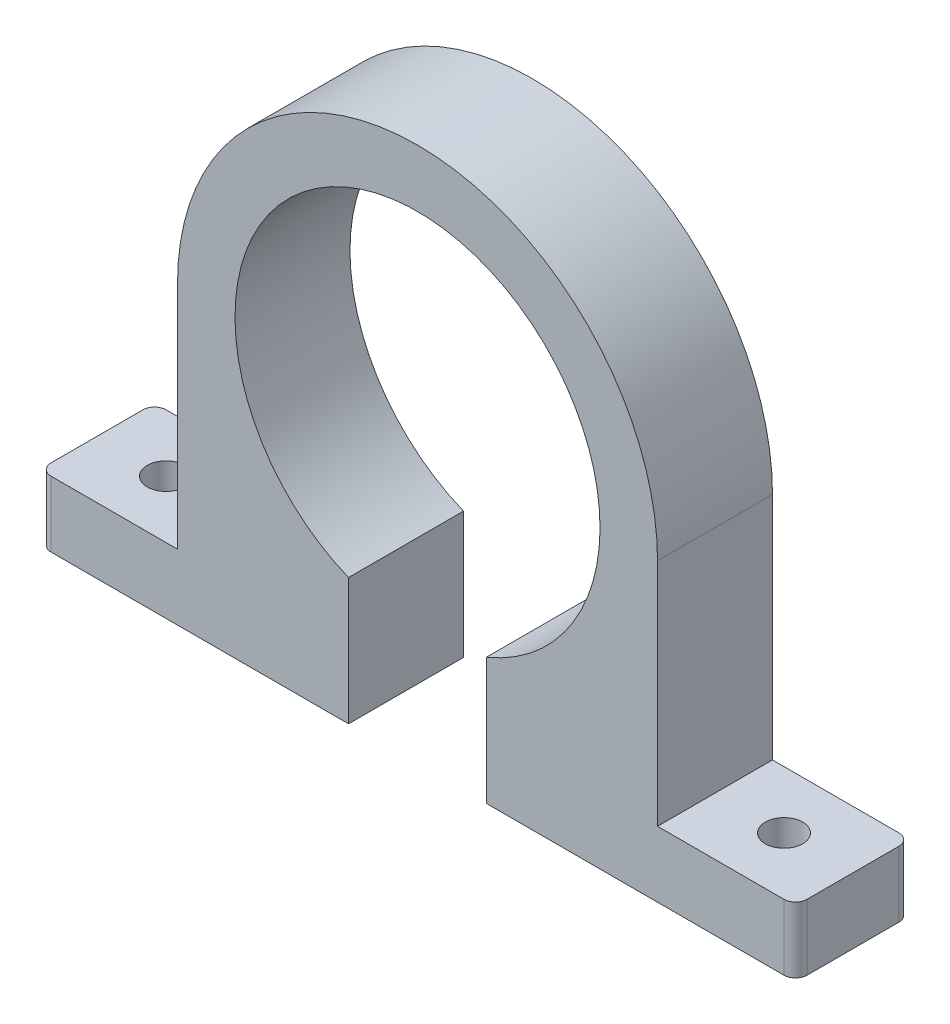
ISO-10303-21;
HEADER;
FILE_DESCRIPTION(('STEP AP214'),'2;1');
FILE_NAME('part.step','',(''),(''),'','','');
FILE_SCHEMA(('AUTOMOTIVE_DESIGN { 1 0 10303 214 1 1 1 1 }'));
ENDSEC;
DATA;
#1=APPLICATION_CONTEXT('core data for automotive mechanical design processes');
#2=APPLICATION_PROTOCOL_DEFINITION('international standard','automotive_design',2000,#1);
#3=PRODUCT_CONTEXT('',#1,'mechanical');
#4=PRODUCT('Part','Part','',(#3));
#5=PRODUCT_RELATED_PRODUCT_CATEGORY('part','',(#4));
#6=PRODUCT_DEFINITION_FORMATION('','',#4);
#7=PRODUCT_DEFINITION_CONTEXT('part definition',#1,'design');
#8=PRODUCT_DEFINITION('design','',#6,#7);
#9=PRODUCT_DEFINITION_SHAPE('','',#8);
#10=(LENGTH_UNIT() NAMED_UNIT(*) SI_UNIT(.MILLI.,.METRE.));
#11=(NAMED_UNIT(*) PLANE_ANGLE_UNIT() SI_UNIT($,.RADIAN.));
#12=(NAMED_UNIT(*) SI_UNIT($,.STERADIAN.) SOLID_ANGLE_UNIT());
#13=UNCERTAINTY_MEASURE_WITH_UNIT(LENGTH_MEASURE(1.E-05),#10,'distance_accuracy_value','');
#14=(GEOMETRIC_REPRESENTATION_CONTEXT(3) GLOBAL_UNCERTAINTY_ASSIGNED_CONTEXT((#13)) GLOBAL_UNIT_ASSIGNED_CONTEXT((#10,
#11,#12)) REPRESENTATION_CONTEXT('',''));
#15=CARTESIAN_POINT('',(0.,0.,0.));
#16=DIRECTION('',(0.,0.,1.));
#17=DIRECTION('',(1.,0.,0.));
#18=AXIS2_PLACEMENT_3D('',#15,#16,#17);
#19=CARTESIAN_POINT('',(32.875,-20.,10.));
#20=DIRECTION('',(0.,-1.,0.));
#21=DIRECTION('',(1.,0.,0.));
#22=AXIS2_PLACEMENT_3D('',#19,#20,#21);
#23=PLANE('',#22);
#24=DIRECTION('',(0.,0.,-1.));
#25=VECTOR('',#24,1.);
#26=CARTESIAN_POINT('',(32.875,-20.,10.));
#27=LINE('',#26,#25);
#28=CARTESIAN_POINT('',(32.875,-20.,9.));
#29=VERTEX_POINT('',#28);
#30=CARTESIAN_POINT('',(32.875,-20.,0.999999999999999));
#31=VERTEX_POINT('',#30);
#32=EDGE_CURVE('E243',#29,#31,#27,.T.);
#33=ORIENTED_EDGE('',*,*,#32,.T.);
#34=CARTESIAN_POINT('',(31.875,-20.,0.999999999999999));
#35=DIRECTION('',(0.,-1.,0.));
#36=DIRECTION('',(1.,0.,0.));
#37=AXIS2_PLACEMENT_3D('',#34,#35,#36);
#38=CIRCLE('',#37,1.);
#39=CARTESIAN_POINT('',(31.875,-20.,0.));
#40=VERTEX_POINT('',#39);
#41=EDGE_CURVE('E185',#31,#40,#38,.F.);
#42=ORIENTED_EDGE('',*,*,#41,.T.);
#43=DIRECTION('',(-1.,0.,0.));
#44=VECTOR('',#43,1.);
#45=CARTESIAN_POINT('',(32.875,-20.,0.));
#46=LINE('',#45,#44);
#47=CARTESIAN_POINT('',(20.875,-20.,0.));
#48=VERTEX_POINT('',#47);
#49=EDGE_CURVE('E265',#40,#48,#46,.T.);
#50=ORIENTED_EDGE('',*,*,#49,.T.);
#51=DIRECTION('',(0.,0.,-1.));
#52=VECTOR('',#51,1.);
#53=CARTESIAN_POINT('',(20.875,-20.,10.));
#54=LINE('',#53,#52);
#55=CARTESIAN_POINT('',(20.875,-20.,10.));
#56=VERTEX_POINT('',#55);
#57=EDGE_CURVE('E240',#56,#48,#54,.T.);
#58=ORIENTED_EDGE('',*,*,#57,.F.);
#59=DIRECTION('',(-1.,0.,0.));
#60=VECTOR('',#59,1.);
#61=CARTESIAN_POINT('',(32.875,-20.,10.));
#62=LINE('',#61,#60);
#63=CARTESIAN_POINT('',(31.875,-20.,10.));
#64=VERTEX_POINT('',#63);
#65=EDGE_CURVE('E293',#64,#56,#62,.T.);
#66=ORIENTED_EDGE('',*,*,#65,.F.);
#67=CARTESIAN_POINT('',(31.875,-20.,9.));
#68=DIRECTION('',(0.,-1.,0.));
#69=DIRECTION('',(1.,0.,0.));
#70=AXIS2_PLACEMENT_3D('',#67,#68,#69);
#71=CIRCLE('',#70,1.);
#72=EDGE_CURVE('E183',#64,#29,#71,.F.);
#73=ORIENTED_EDGE('',*,*,#72,.T.);
#74=EDGE_LOOP('',(#33,#42,#50,#58,#66,#73));
#75=FACE_BOUND('',#74,.T.);
#76=CARTESIAN_POINT('',(26.875,-20.,5.));
#77=DIRECTION('',(0.,1.,0.));
#78=DIRECTION('',(0.,0.,1.));
#79=AXIS2_PLACEMENT_3D('',#76,#77,#78);
#80=CIRCLE('',#79,1.63195);
#81=CARTESIAN_POINT('',(26.875,-20.,6.63195));
#82=VERTEX_POINT('',#81);
#83=EDGE_CURVE('E284',#82,#82,#80,.T.);
#84=ORIENTED_EDGE('',*,*,#83,.F.);
#85=EDGE_LOOP('',(#84));
#86=FACE_BOUND('',#85,.T.);
#87=ADVANCED_FACE('F33',(#75,#86),#23,.F.);
#88=CARTESIAN_POINT('',(-6.,-25.72,10.));
#89=DIRECTION('',(-1.,0.,0.));
#90=DIRECTION('',(0.,0.,1.));
#91=AXIS2_PLACEMENT_3D('',#88,#89,#90);
#92=PLANE('',#91);
#93=DIRECTION('',(0.,1.,0.));
#94=VECTOR('',#93,1.);
#95=CARTESIAN_POINT('',(-6.,-25.72,0.));
#96=LINE('',#95,#94);
#97=CARTESIAN_POINT('',(-6.,-25.72,0.));
#98=VERTEX_POINT('',#97);
#99=CARTESIAN_POINT('',(-6.,-14.6974700203811,0.));
#100=VERTEX_POINT('',#99);
#101=EDGE_CURVE('E172',#98,#100,#96,.T.);
#102=ORIENTED_EDGE('',*,*,#101,.T.);
#103=DIRECTION('',(0.,0.,-1.));
#104=VECTOR('',#103,1.);
#105=CARTESIAN_POINT('',(-6.,-14.6974700203811,10.));
#106=LINE('',#105,#104);
#107=CARTESIAN_POINT('',(-6.,-14.6974700203811,10.));
#108=VERTEX_POINT('',#107);
#109=EDGE_CURVE('E150',#108,#100,#106,.T.);
#110=ORIENTED_EDGE('',*,*,#109,.F.);
#111=DIRECTION('',(0.,1.,0.));
#112=VECTOR('',#111,1.);
#113=CARTESIAN_POINT('',(-6.,-25.72,10.));
#114=LINE('',#113,#112);
#115=CARTESIAN_POINT('',(-6.,-25.72,10.));
#116=VERTEX_POINT('',#115);
#117=EDGE_CURVE('E157',#116,#108,#114,.T.);
#118=ORIENTED_EDGE('',*,*,#117,.F.);
#119=DIRECTION('',(0.,0.,-1.));
#120=VECTOR('',#119,1.);
#121=CARTESIAN_POINT('',(-6.,-25.72,10.));
#122=LINE('',#121,#120);
#123=EDGE_CURVE('E226',#116,#98,#122,.T.);
#124=ORIENTED_EDGE('',*,*,#123,.T.);
#125=EDGE_LOOP('',(#102,#110,#118,#124));
#126=FACE_BOUND('',#125,.T.);
#127=ADVANCED_FACE('F170',(#126),#92,.F.);
#128=CARTESIAN_POINT('',(0.,0.,10.));
#129=DIRECTION('',(0.,0.,-1.));
#130=DIRECTION('',(-1.,0.,0.));
#131=AXIS2_PLACEMENT_3D('',#128,#129,#130);
#132=CYLINDRICAL_SURFACE('',#131,15.875);
#133=CARTESIAN_POINT('',(0.,0.,0.));
#134=DIRECTION('',(0.,0.,-1.));
#135=DIRECTION('',(1.,0.,0.));
#136=AXIS2_PLACEMENT_3D('',#133,#134,#135);
#137=CIRCLE('',#136,15.875);
#138=CARTESIAN_POINT('',(6.,-14.6974700203811,0.));
#139=VERTEX_POINT('',#138);
#140=EDGE_CURVE('E269',#100,#139,#137,.T.);
#141=ORIENTED_EDGE('',*,*,#140,.T.);
#142=DIRECTION('',(0.,0.,-1.));
#143=VECTOR('',#142,1.);
#144=CARTESIAN_POINT('',(6.,-14.6974700203811,10.));
#145=LINE('',#144,#143);
#146=CARTESIAN_POINT('',(6.,-14.6974700203811,10.));
#147=VERTEX_POINT('',#146);
#148=EDGE_CURVE('E153',#147,#139,#145,.T.);
#149=ORIENTED_EDGE('',*,*,#148,.F.);
#150=CARTESIAN_POINT('',(0.,0.,10.));
#151=DIRECTION('',(0.,0.,-1.));
#152=DIRECTION('',(1.,0.,0.));
#153=AXIS2_PLACEMENT_3D('',#150,#151,#152);
#154=CIRCLE('',#153,15.875);
#155=EDGE_CURVE('E146',#108,#147,#154,.T.);
#156=ORIENTED_EDGE('',*,*,#155,.F.);
#157=ORIENTED_EDGE('',*,*,#109,.T.);
#158=EDGE_LOOP('',(#141,#149,#156,#157));
#159=FACE_BOUND('',#158,.T.);
#160=ADVANCED_FACE('F148',(#159),#132,.F.);
#161=CARTESIAN_POINT('',(6.,-25.72,10.));
#162=DIRECTION('',(1.,0.,0.));
#163=DIRECTION('',(0.,0.,-1.));
#164=AXIS2_PLACEMENT_3D('',#161,#162,#163);
#165=PLANE('',#164);
#166=DIRECTION('',(0.,-1.,0.));
#167=VECTOR('',#166,1.);
#168=CARTESIAN_POINT('',(6.,-25.72,0.));
#169=LINE('',#168,#167);
#170=CARTESIAN_POINT('',(6.,-25.72,0.));
#171=VERTEX_POINT('',#170);
#172=EDGE_CURVE('E263',#139,#171,#169,.T.);
#173=ORIENTED_EDGE('',*,*,#172,.T.);
#174=DIRECTION('',(0.,0.,-1.));
#175=VECTOR('',#174,1.);
#176=CARTESIAN_POINT('',(6.,-25.72,10.));
#177=LINE('',#176,#175);
#178=CARTESIAN_POINT('',(6.,-25.72,10.));
#179=VERTEX_POINT('',#178);
#180=EDGE_CURVE('E177',#179,#171,#177,.T.);
#181=ORIENTED_EDGE('',*,*,#180,.F.);
#182=DIRECTION('',(0.,-1.,0.));
#183=VECTOR('',#182,1.);
#184=CARTESIAN_POINT('',(6.,-25.72,10.));
#185=LINE('',#184,#183);
#186=EDGE_CURVE('E156',#147,#179,#185,.T.);
#187=ORIENTED_EDGE('',*,*,#186,.F.);
#188=ORIENTED_EDGE('',*,*,#148,.T.);
#189=EDGE_LOOP('',(#173,#181,#187,#188));
#190=FACE_BOUND('',#189,.T.);
#191=ADVANCED_FACE('F337',(#190),#165,.F.);
#192=CARTESIAN_POINT('',(6.,-25.72,10.));
#193=DIRECTION('',(0.,1.,0.));
#194=DIRECTION('',(0.,0.,1.));
#195=AXIS2_PLACEMENT_3D('',#192,#193,#194);
#196=PLANE('',#195);
#197=CARTESIAN_POINT('',(26.875,-25.72,5.));
#198=DIRECTION('',(0.,1.,0.));
#199=DIRECTION('',(0.,0.,1.));
#200=AXIS2_PLACEMENT_3D('',#197,#198,#199);
#201=CIRCLE('',#200,1.63195);
#202=CARTESIAN_POINT('',(26.875,-25.72,6.63195));
#203=VERTEX_POINT('',#202);
#204=EDGE_CURVE('E281',#203,#203,#201,.T.);
#205=ORIENTED_EDGE('',*,*,#204,.T.);
#206=EDGE_LOOP('',(#205));
#207=FACE_BOUND('',#206,.T.);
#208=DIRECTION('',(1.,0.,0.));
#209=VECTOR('',#208,1.);
#210=CARTESIAN_POINT('',(6.,-25.72,0.));
#211=LINE('',#210,#209);
#212=CARTESIAN_POINT('',(31.875,-25.72,0.));
#213=VERTEX_POINT('',#212);
#214=EDGE_CURVE('E255',#171,#213,#211,.T.);
#215=ORIENTED_EDGE('',*,*,#214,.T.);
#216=CARTESIAN_POINT('',(31.875,-25.72,0.999999999999999));
#217=DIRECTION('',(0.,1.,0.));
#218=DIRECTION('',(0.,0.,1.));
#219=AXIS2_PLACEMENT_3D('',#216,#217,#218);
#220=CIRCLE('',#219,1.);
#221=CARTESIAN_POINT('',(32.875,-25.72,0.999999999999999));
#222=VERTEX_POINT('',#221);
#223=EDGE_CURVE('E193',#213,#222,#220,.F.);
#224=ORIENTED_EDGE('',*,*,#223,.T.);
#225=DIRECTION('',(0.,0.,-1.));
#226=VECTOR('',#225,1.);
#227=CARTESIAN_POINT('',(32.875,-25.72,10.));
#228=LINE('',#227,#226);
#229=CARTESIAN_POINT('',(32.875,-25.72,9.));
#230=VERTEX_POINT('',#229);
#231=EDGE_CURVE('E246',#230,#222,#228,.T.);
#232=ORIENTED_EDGE('',*,*,#231,.F.);
#233=CARTESIAN_POINT('',(31.875,-25.72,9.));
#234=DIRECTION('',(0.,1.,0.));
#235=DIRECTION('',(0.,0.,1.));
#236=AXIS2_PLACEMENT_3D('',#233,#234,#235);
#237=CIRCLE('',#236,1.);
#238=CARTESIAN_POINT('',(31.875,-25.72,10.));
#239=VERTEX_POINT('',#238);
#240=EDGE_CURVE('E191',#230,#239,#237,.F.);
#241=ORIENTED_EDGE('',*,*,#240,.T.);
#242=DIRECTION('',(1.,0.,0.));
#243=VECTOR('',#242,1.);
#244=CARTESIAN_POINT('',(6.,-25.72,10.));
#245=LINE('',#244,#243);
#246=EDGE_CURVE('E257',#179,#239,#245,.T.);
#247=ORIENTED_EDGE('',*,*,#246,.F.);
#248=ORIENTED_EDGE('',*,*,#180,.T.);
#249=EDGE_LOOP('',(#215,#224,#232,#241,#247,#248));
#250=FACE_BOUND('',#249,.T.);
#251=ADVANCED_FACE('F254',(#207,#250),#196,.F.);
#252=CARTESIAN_POINT('',(32.875,-25.72,10.));
#253=DIRECTION('',(-1.,0.,0.));
#254=DIRECTION('',(0.,0.,1.));
#255=AXIS2_PLACEMENT_3D('',#252,#253,#254);
#256=PLANE('',#255);
#257=ORIENTED_EDGE('',*,*,#231,.T.);
#258=DIRECTION('',(0.,1.,0.));
#259=VECTOR('',#258,1.);
#260=CARTESIAN_POINT('',(32.875,-25.72,0.999999999999999));
#261=LINE('',#260,#259);
#262=EDGE_CURVE('E175',#222,#31,#261,.T.);
#263=ORIENTED_EDGE('',*,*,#262,.T.);
#264=ORIENTED_EDGE('',*,*,#32,.F.);
#265=DIRECTION('',(0.,1.,0.));
#266=VECTOR('',#265,1.);
#267=CARTESIAN_POINT('',(32.875,-25.72,9.));
#268=LINE('',#267,#266);
#269=EDGE_CURVE('E173',#29,#230,#268,.F.);
#270=ORIENTED_EDGE('',*,*,#269,.T.);
#271=EDGE_LOOP('',(#257,#263,#264,#270));
#272=FACE_BOUND('',#271,.T.);
#273=ADVANCED_FACE('F331',(#272),#256,.F.);
#274=CARTESIAN_POINT('',(20.875,-20.,10.));
#275=DIRECTION('',(-1.,0.,0.));
#276=DIRECTION('',(0.,-1.,0.));
#277=AXIS2_PLACEMENT_3D('',#274,#275,#276);
#278=PLANE('',#277);
#279=DIRECTION('',(0.,1.,0.));
#280=VECTOR('',#279,1.);
#281=CARTESIAN_POINT('',(20.875,-20.,0.));
#282=LINE('',#281,#280);
#283=CARTESIAN_POINT('',(20.875,0.,0.));
#284=VERTEX_POINT('',#283);
#285=EDGE_CURVE('E267',#48,#284,#282,.T.);
#286=ORIENTED_EDGE('',*,*,#285,.T.);
#287=DIRECTION('',(0.,0.,-1.));
#288=VECTOR('',#287,1.);
#289=CARTESIAN_POINT('',(20.875,0.,10.));
#290=LINE('',#289,#288);
#291=CARTESIAN_POINT('',(20.875,0.,10.));
#292=VERTEX_POINT('',#291);
#293=EDGE_CURVE('E237',#292,#284,#290,.T.);
#294=ORIENTED_EDGE('',*,*,#293,.F.);
#295=DIRECTION('',(0.,1.,0.));
#296=VECTOR('',#295,1.);
#297=CARTESIAN_POINT('',(20.875,-20.,10.));
#298=LINE('',#297,#296);
#299=EDGE_CURVE('E291',#56,#292,#298,.T.);
#300=ORIENTED_EDGE('',*,*,#299,.F.);
#301=ORIENTED_EDGE('',*,*,#57,.T.);
#302=EDGE_LOOP('',(#286,#294,#300,#301));
#303=FACE_BOUND('',#302,.T.);
#304=ADVANCED_FACE('F329',(#303),#278,.F.);
#305=CARTESIAN_POINT('',(0.,0.,10.));
#306=DIRECTION('',(0.,0.,-1.));
#307=DIRECTION('',(-1.,0.,0.));
#308=AXIS2_PLACEMENT_3D('',#305,#306,#307);
#309=CYLINDRICAL_SURFACE('',#308,20.875);
#310=CARTESIAN_POINT('',(0.,0.,0.));
#311=DIRECTION('',(0.,0.,1.));
#312=DIRECTION('',(1.,0.,0.));
#313=AXIS2_PLACEMENT_3D('',#310,#311,#312);
#314=CIRCLE('',#313,20.875);
#315=CARTESIAN_POINT('',(-20.875,0.,0.));
#316=VERTEX_POINT('',#315);
#317=EDGE_CURVE('E274',#284,#316,#314,.T.);
#318=ORIENTED_EDGE('',*,*,#317,.T.);
#319=DIRECTION('',(0.,0.,-1.));
#320=VECTOR('',#319,1.);
#321=CARTESIAN_POINT('',(-20.875,0.,10.));
#322=LINE('',#321,#320);
#323=CARTESIAN_POINT('',(-20.875,0.,10.));
#324=VERTEX_POINT('',#323);
#325=EDGE_CURVE('E234',#324,#316,#322,.T.);
#326=ORIENTED_EDGE('',*,*,#325,.F.);
#327=CARTESIAN_POINT('',(0.,0.,10.));
#328=DIRECTION('',(0.,0.,1.));
#329=DIRECTION('',(1.,0.,0.));
#330=AXIS2_PLACEMENT_3D('',#327,#328,#329);
#331=CIRCLE('',#330,20.875);
#332=EDGE_CURVE('E289',#292,#324,#331,.T.);
#333=ORIENTED_EDGE('',*,*,#332,.F.);
#334=ORIENTED_EDGE('',*,*,#293,.T.);
#335=EDGE_LOOP('',(#318,#326,#333,#334));
#336=FACE_BOUND('',#335,.T.);
#337=ADVANCED_FACE('F316',(#336),#309,.T.);
#338=CARTESIAN_POINT('',(-20.875,0.,10.));
#339=DIRECTION('',(1.,0.,0.));
#340=DIRECTION('',(0.,1.,0.));
#341=AXIS2_PLACEMENT_3D('',#338,#339,#340);
#342=PLANE('',#341);
#343=DIRECTION('',(0.,-1.,0.));
#344=VECTOR('',#343,1.);
#345=CARTESIAN_POINT('',(-20.875,0.,0.));
#346=LINE('',#345,#344);
#347=CARTESIAN_POINT('',(-20.875,-20.,0.));
#348=VERTEX_POINT('',#347);
#349=EDGE_CURVE('E276',#316,#348,#346,.T.);
#350=ORIENTED_EDGE('',*,*,#349,.T.);
#351=DIRECTION('',(0.,0.,-1.));
#352=VECTOR('',#351,1.);
#353=CARTESIAN_POINT('',(-20.875,-20.,10.));
#354=LINE('',#353,#352);
#355=CARTESIAN_POINT('',(-20.875,-20.,10.));
#356=VERTEX_POINT('',#355);
#357=EDGE_CURVE('E228',#356,#348,#354,.T.);
#358=ORIENTED_EDGE('',*,*,#357,.F.);
#359=DIRECTION('',(0.,-1.,0.));
#360=VECTOR('',#359,1.);
#361=CARTESIAN_POINT('',(-20.875,0.,10.));
#362=LINE('',#361,#360);
#363=EDGE_CURVE('E217',#324,#356,#362,.T.);
#364=ORIENTED_EDGE('',*,*,#363,.F.);
#365=ORIENTED_EDGE('',*,*,#325,.T.);
#366=EDGE_LOOP('',(#350,#358,#364,#365));
#367=FACE_BOUND('',#366,.T.);
#368=ADVANCED_FACE('F309',(#367),#342,.F.);
#369=CARTESIAN_POINT('',(-20.875,-20.,10.));
#370=DIRECTION('',(0.,-1.,0.));
#371=DIRECTION('',(1.,0.,0.));
#372=AXIS2_PLACEMENT_3D('',#369,#370,#371);
#373=PLANE('',#372);
#374=CARTESIAN_POINT('',(-26.875,-20.,5.));
#375=DIRECTION('',(0.,1.,0.));
#376=DIRECTION('',(0.,0.,1.));
#377=AXIS2_PLACEMENT_3D('',#374,#375,#376);
#378=CIRCLE('',#377,1.63195);
#379=CARTESIAN_POINT('',(-26.875,-20.,6.63195));
#380=VERTEX_POINT('',#379);
#381=EDGE_CURVE('E302',#380,#380,#378,.T.);
#382=ORIENTED_EDGE('',*,*,#381,.F.);
#383=EDGE_LOOP('',(#382));
#384=FACE_BOUND('',#383,.T.);
#385=DIRECTION('',(-1.,0.,0.));
#386=VECTOR('',#385,1.);
#387=CARTESIAN_POINT('',(-20.875,-20.,0.));
#388=LINE('',#387,#386);
#389=CARTESIAN_POINT('',(-31.875,-20.,0.));
#390=VERTEX_POINT('',#389);
#391=EDGE_CURVE('E278',#348,#390,#388,.T.);
#392=ORIENTED_EDGE('',*,*,#391,.T.);
#393=CARTESIAN_POINT('',(-31.875,-20.,0.999999999999999));
#394=DIRECTION('',(0.,-1.,0.));
#395=DIRECTION('',(1.,0.,0.));
#396=AXIS2_PLACEMENT_3D('',#393,#394,#395);
#397=CIRCLE('',#396,1.);
#398=CARTESIAN_POINT('',(-32.875,-20.,0.999999999999999));
#399=VERTEX_POINT('',#398);
#400=EDGE_CURVE('E11',#390,#399,#397,.F.);
#401=ORIENTED_EDGE('',*,*,#400,.T.);
#402=DIRECTION('',(0.,0.,-1.));
#403=VECTOR('',#402,1.);
#404=CARTESIAN_POINT('',(-32.875,-20.,10.));
#405=LINE('',#404,#403);
#406=CARTESIAN_POINT('',(-32.875,-20.,9.));
#407=VERTEX_POINT('',#406);
#408=EDGE_CURVE('E213',#407,#399,#405,.T.);
#409=ORIENTED_EDGE('',*,*,#408,.F.);
#410=CARTESIAN_POINT('',(-31.875,-20.,9.));
#411=DIRECTION('',(0.,-1.,0.));
#412=DIRECTION('',(1.,0.,0.));
#413=AXIS2_PLACEMENT_3D('',#410,#411,#412);
#414=CIRCLE('',#413,1.);
#415=CARTESIAN_POINT('',(-31.875,-20.,10.));
#416=VERTEX_POINT('',#415);
#417=EDGE_CURVE('E41',#407,#416,#414,.F.);
#418=ORIENTED_EDGE('',*,*,#417,.T.);
#419=DIRECTION('',(-1.,0.,0.));
#420=VECTOR('',#419,1.);
#421=CARTESIAN_POINT('',(-20.875,-20.,10.));
#422=LINE('',#421,#420);
#423=EDGE_CURVE('E212',#356,#416,#422,.T.);
#424=ORIENTED_EDGE('',*,*,#423,.F.);
#425=ORIENTED_EDGE('',*,*,#357,.T.);
#426=EDGE_LOOP('',(#392,#401,#409,#418,#424,#425));
#427=FACE_BOUND('',#426,.T.);
#428=ADVANCED_FACE('F210',(#384,#427),#373,.F.);
#429=CARTESIAN_POINT('',(-32.875,-20.,10.));
#430=DIRECTION('',(1.,0.,0.));
#431=DIRECTION('',(0.,0.,-1.));
#432=AXIS2_PLACEMENT_3D('',#429,#430,#431);
#433=PLANE('',#432);
#434=ORIENTED_EDGE('',*,*,#408,.T.);
#435=DIRECTION('',(0.,-1.,0.));
#436=VECTOR('',#435,1.);
#437=CARTESIAN_POINT('',(-32.875,-20.,0.999999999999999));
#438=LINE('',#437,#436);
#439=CARTESIAN_POINT('',(-32.875,-25.72,0.999999999999999));
#440=VERTEX_POINT('',#439);
#441=EDGE_CURVE('E201',#399,#440,#438,.T.);
#442=ORIENTED_EDGE('',*,*,#441,.T.);
#443=DIRECTION('',(0.,0.,-1.));
#444=VECTOR('',#443,1.);
#445=CARTESIAN_POINT('',(-32.875,-25.72,10.));
#446=LINE('',#445,#444);
#447=CARTESIAN_POINT('',(-32.875,-25.72,9.));
#448=VERTEX_POINT('',#447);
#449=EDGE_CURVE('E223',#448,#440,#446,.T.);
#450=ORIENTED_EDGE('',*,*,#449,.F.);
#451=DIRECTION('',(0.,-1.,0.));
#452=VECTOR('',#451,1.);
#453=CARTESIAN_POINT('',(-32.875,-20.,9.));
#454=LINE('',#453,#452);
#455=EDGE_CURVE('E53',#448,#407,#454,.F.);
#456=ORIENTED_EDGE('',*,*,#455,.T.);
#457=EDGE_LOOP('',(#434,#442,#450,#456));
#458=FACE_BOUND('',#457,.T.);
#459=ADVANCED_FACE('F224',(#458),#433,.F.);
#460=CARTESIAN_POINT('',(-32.875,-25.72,10.));
#461=DIRECTION('',(0.,1.,0.));
#462=DIRECTION('',(0.,0.,1.));
#463=AXIS2_PLACEMENT_3D('',#460,#461,#462);
#464=PLANE('',#463);
#465=CARTESIAN_POINT('',(-26.875,-25.72,5.));
#466=DIRECTION('',(0.,1.,0.));
#467=DIRECTION('',(0.,0.,1.));
#468=AXIS2_PLACEMENT_3D('',#465,#466,#467);
#469=CIRCLE('',#468,1.63195);
#470=CARTESIAN_POINT('',(-26.875,-25.72,6.63195));
#471=VERTEX_POINT('',#470);
#472=EDGE_CURVE('E299',#471,#471,#469,.T.);
#473=ORIENTED_EDGE('',*,*,#472,.T.);
#474=EDGE_LOOP('',(#473));
#475=FACE_BOUND('',#474,.T.);
#476=ORIENTED_EDGE('',*,*,#449,.T.);
#477=CARTESIAN_POINT('',(-31.875,-25.72,0.999999999999999));
#478=DIRECTION('',(0.,1.,0.));
#479=DIRECTION('',(0.,0.,1.));
#480=AXIS2_PLACEMENT_3D('',#477,#478,#479);
#481=CIRCLE('',#480,1.);
#482=CARTESIAN_POINT('',(-31.875,-25.72,0.));
#483=VERTEX_POINT('',#482);
#484=EDGE_CURVE('E206',#440,#483,#481,.F.);
#485=ORIENTED_EDGE('',*,*,#484,.T.);
#486=DIRECTION('',(1.,0.,0.));
#487=VECTOR('',#486,1.);
#488=CARTESIAN_POINT('',(-32.875,-25.72,0.));
#489=LINE('',#488,#487);
#490=EDGE_CURVE('E168',#483,#98,#489,.T.);
#491=ORIENTED_EDGE('',*,*,#490,.T.);
#492=ORIENTED_EDGE('',*,*,#123,.F.);
#493=DIRECTION('',(1.,0.,0.));
#494=VECTOR('',#493,1.);
#495=CARTESIAN_POINT('',(-32.875,-25.72,10.));
#496=LINE('',#495,#494);
#497=CARTESIAN_POINT('',(-31.875,-25.72,10.));
#498=VERTEX_POINT('',#497);
#499=EDGE_CURVE('E164',#498,#116,#496,.T.);
#500=ORIENTED_EDGE('',*,*,#499,.F.);
#501=CARTESIAN_POINT('',(-31.875,-25.72,9.));
#502=DIRECTION('',(0.,1.,0.));
#503=DIRECTION('',(0.,0.,1.));
#504=AXIS2_PLACEMENT_3D('',#501,#502,#503);
#505=CIRCLE('',#504,1.);
#506=EDGE_CURVE('E204',#498,#448,#505,.F.);
#507=ORIENTED_EDGE('',*,*,#506,.T.);
#508=EDGE_LOOP('',(#476,#485,#491,#492,#500,#507));
#509=FACE_BOUND('',#508,.T.);
#510=ADVANCED_FACE('F222',(#475,#509),#464,.F.);
#511=CARTESIAN_POINT('',(0.,0.,10.));
#512=DIRECTION('',(0.,0.,1.));
#513=DIRECTION('',(1.,0.,0.));
#514=AXIS2_PLACEMENT_3D('',#511,#512,#513);
#515=PLANE('',#514);
#516=ORIENTED_EDGE('',*,*,#246,.T.);
#517=DIRECTION('',(0.,1.,0.));
#518=VECTOR('',#517,1.);
#519=CARTESIAN_POINT('',(31.875,-20.,10.));
#520=LINE('',#519,#518);
#521=EDGE_CURVE('E197',#239,#64,#520,.T.);
#522=ORIENTED_EDGE('',*,*,#521,.T.);
#523=ORIENTED_EDGE('',*,*,#65,.T.);
#524=ORIENTED_EDGE('',*,*,#299,.T.);
#525=ORIENTED_EDGE('',*,*,#332,.T.);
#526=ORIENTED_EDGE('',*,*,#363,.T.);
#527=ORIENTED_EDGE('',*,*,#423,.T.);
#528=DIRECTION('',(0.,-1.,0.));
#529=VECTOR('',#528,1.);
#530=CARTESIAN_POINT('',(-31.875,-25.72,10.));
#531=LINE('',#530,#529);
#532=EDGE_CURVE('E195',#416,#498,#531,.T.);
#533=ORIENTED_EDGE('',*,*,#532,.T.);
#534=ORIENTED_EDGE('',*,*,#499,.T.);
#535=ORIENTED_EDGE('',*,*,#117,.T.);
#536=ORIENTED_EDGE('',*,*,#155,.T.);
#537=ORIENTED_EDGE('',*,*,#186,.T.);
#538=EDGE_LOOP('',(#516,#522,#523,#524,#525,#526,#527,#533,#534,#535,#536,#537));
#539=FACE_BOUND('',#538,.T.);
#540=ADVANCED_FACE('F161',(#539),#515,.T.);
#541=CARTESIAN_POINT('',(0.,0.,0.));
#542=DIRECTION('',(0.,0.,1.));
#543=DIRECTION('',(1.,0.,0.));
#544=AXIS2_PLACEMENT_3D('',#541,#542,#543);
#545=PLANE('',#544);
#546=ORIENTED_EDGE('',*,*,#49,.F.);
#547=DIRECTION('',(0.,1.,0.));
#548=VECTOR('',#547,1.);
#549=CARTESIAN_POINT('',(31.875,0.,0.));
#550=LINE('',#549,#548);
#551=EDGE_CURVE('E189',#40,#213,#550,.F.);
#552=ORIENTED_EDGE('',*,*,#551,.T.);
#553=ORIENTED_EDGE('',*,*,#214,.F.);
#554=ORIENTED_EDGE('',*,*,#172,.F.);
#555=ORIENTED_EDGE('',*,*,#140,.F.);
#556=ORIENTED_EDGE('',*,*,#101,.F.);
#557=ORIENTED_EDGE('',*,*,#490,.F.);
#558=DIRECTION('',(0.,-1.,0.));
#559=VECTOR('',#558,1.);
#560=CARTESIAN_POINT('',(-31.875,0.,0.));
#561=LINE('',#560,#559);
#562=EDGE_CURVE('E187',#483,#390,#561,.F.);
#563=ORIENTED_EDGE('',*,*,#562,.T.);
#564=ORIENTED_EDGE('',*,*,#391,.F.);
#565=ORIENTED_EDGE('',*,*,#349,.F.);
#566=ORIENTED_EDGE('',*,*,#317,.F.);
#567=ORIENTED_EDGE('',*,*,#285,.F.);
#568=EDGE_LOOP('',(#546,#552,#553,#554,#555,#556,#557,#563,#564,#565,#566,#567));
#569=FACE_BOUND('',#568,.T.);
#570=ADVANCED_FACE('F262',(#569),#545,.F.);
#571=CARTESIAN_POINT('',(31.875,-25.72,0.999999999999999));
#572=DIRECTION('',(0.,1.,0.));
#573=DIRECTION('',(0.,0.,1.));
#574=AXIS2_PLACEMENT_3D('',#571,#572,#573);
#575=CYLINDRICAL_SURFACE('',#574,1.);
#576=ORIENTED_EDGE('',*,*,#223,.F.);
#577=ORIENTED_EDGE('',*,*,#551,.F.);
#578=ORIENTED_EDGE('',*,*,#41,.F.);
#579=ORIENTED_EDGE('',*,*,#262,.F.);
#580=EDGE_LOOP('',(#576,#577,#578,#579));
#581=FACE_BOUND('',#580,.T.);
#582=ADVANCED_FACE('F343',(#581),#575,.T.);
#583=CARTESIAN_POINT('',(31.875,0.,9.));
#584=DIRECTION('',(0.,-1.,0.));
#585=DIRECTION('',(0.,0.,-1.));
#586=AXIS2_PLACEMENT_3D('',#583,#584,#585);
#587=CYLINDRICAL_SURFACE('',#586,1.);
#588=ORIENTED_EDGE('',*,*,#240,.F.);
#589=ORIENTED_EDGE('',*,*,#269,.F.);
#590=ORIENTED_EDGE('',*,*,#72,.F.);
#591=ORIENTED_EDGE('',*,*,#521,.F.);
#592=EDGE_LOOP('',(#588,#589,#590,#591));
#593=FACE_BOUND('',#592,.T.);
#594=ADVANCED_FACE('F346',(#593),#587,.T.);
#595=CARTESIAN_POINT('',(-31.875,-20.,0.999999999999999));
#596=DIRECTION('',(0.,-1.,0.));
#597=DIRECTION('',(0.,0.,-1.));
#598=AXIS2_PLACEMENT_3D('',#595,#596,#597);
#599=CYLINDRICAL_SURFACE('',#598,1.);
#600=ORIENTED_EDGE('',*,*,#400,.F.);
#601=ORIENTED_EDGE('',*,*,#562,.F.);
#602=ORIENTED_EDGE('',*,*,#484,.F.);
#603=ORIENTED_EDGE('',*,*,#441,.F.);
#604=EDGE_LOOP('',(#600,#601,#602,#603));
#605=FACE_BOUND('',#604,.T.);
#606=ADVANCED_FACE('F349',(#605),#599,.T.);
#607=CARTESIAN_POINT('',(-31.875,0.,9.));
#608=DIRECTION('',(0.,1.,0.));
#609=DIRECTION('',(0.,0.,1.));
#610=AXIS2_PLACEMENT_3D('',#607,#608,#609);
#611=CYLINDRICAL_SURFACE('',#610,1.);
#612=ORIENTED_EDGE('',*,*,#417,.F.);
#613=ORIENTED_EDGE('',*,*,#455,.F.);
#614=ORIENTED_EDGE('',*,*,#506,.F.);
#615=ORIENTED_EDGE('',*,*,#532,.F.);
#616=EDGE_LOOP('',(#612,#613,#614,#615));
#617=FACE_BOUND('',#616,.T.);
#618=ADVANCED_FACE('F35',(#617),#611,.T.);
#619=CARTESIAN_POINT('',(26.875,-20.,5.));
#620=DIRECTION('',(0.,1.,0.));
#621=DIRECTION('',(0.,0.,1.));
#622=AXIS2_PLACEMENT_3D('',#619,#620,#621);
#623=CYLINDRICAL_SURFACE('',#622,1.63195);
#624=ORIENTED_EDGE('',*,*,#204,.F.);
#625=EDGE_LOOP('',(#624));
#626=FACE_BOUND('',#625,.T.);
#627=ORIENTED_EDGE('',*,*,#83,.T.);
#628=EDGE_LOOP('',(#627));
#629=FACE_BOUND('',#628,.T.);
#630=ADVANCED_FACE('F356',(#626,#629),#623,.F.);
#631=CARTESIAN_POINT('',(-26.875,-20.,5.));
#632=DIRECTION('',(0.,1.,0.));
#633=DIRECTION('',(0.,0.,1.));
#634=AXIS2_PLACEMENT_3D('',#631,#632,#633);
#635=CYLINDRICAL_SURFACE('',#634,1.63195);
#636=ORIENTED_EDGE('',*,*,#472,.F.);
#637=EDGE_LOOP('',(#636));
#638=FACE_BOUND('',#637,.T.);
#639=ORIENTED_EDGE('',*,*,#381,.T.);
#640=EDGE_LOOP('',(#639));
#641=FACE_BOUND('',#640,.T.);
#642=ADVANCED_FACE('F306',(#638,#641),#635,.F.);
#643=CLOSED_SHELL('',(#87,#127,#160,#191,#251,#273,#304,#337,#368,#428,#459,#510,#540,#570,#582,
#594,#606,#618,#630,#642));
#644=MANIFOLD_SOLID_BREP('B2',#643);
#645=ADVANCED_BREP_SHAPE_REPRESENTATION('',(#18,#644),#14);
#646=SHAPE_DEFINITION_REPRESENTATION(#9,#645);
ENDSEC;
END-ISO-10303-21;
